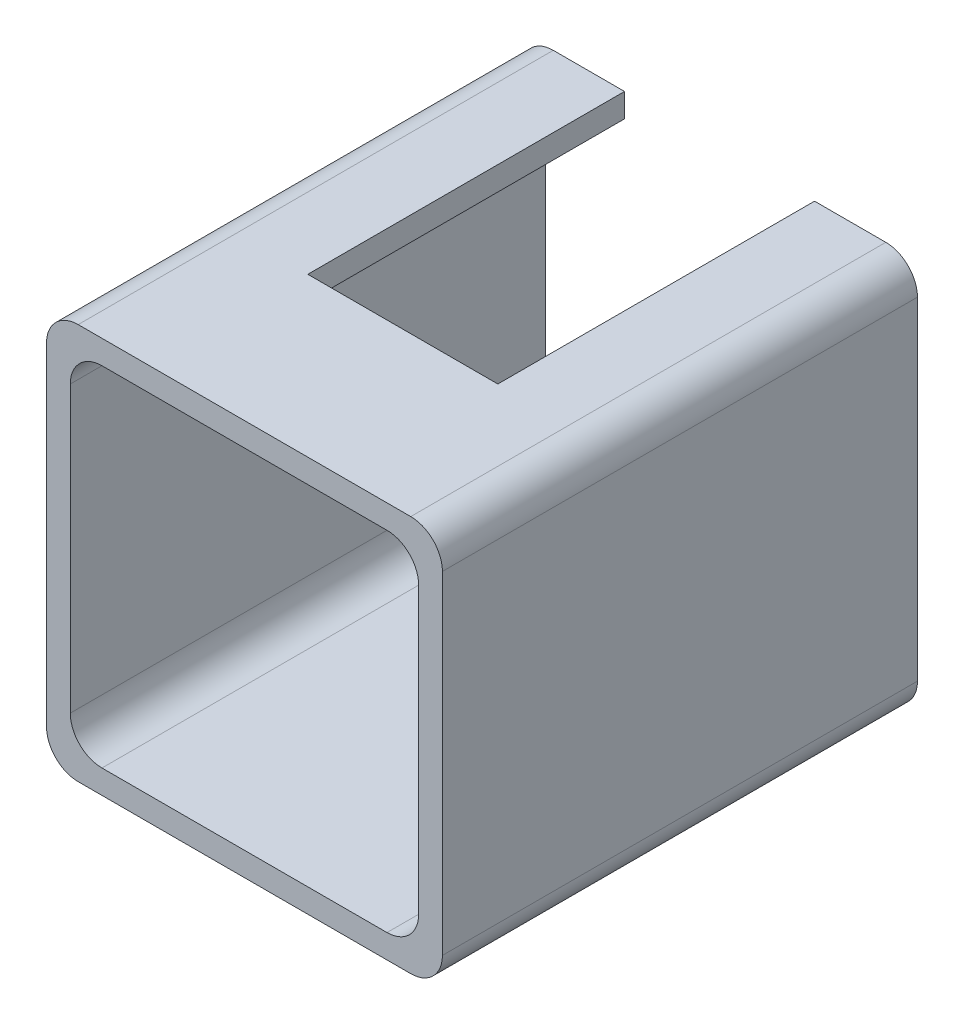
ISO-10303-21;
HEADER;
FILE_DESCRIPTION(('STEP AP214'),'2;1');
FILE_NAME('part.step','',(''),(''),'','','');
FILE_SCHEMA(('AUTOMOTIVE_DESIGN { 1 0 10303 214 1 1 1 1 }'));
ENDSEC;
DATA;
#1=APPLICATION_CONTEXT('core data for automotive mechanical design processes');
#2=APPLICATION_PROTOCOL_DEFINITION('international standard','automotive_design',2000,#1);
#3=PRODUCT_CONTEXT('',#1,'mechanical');
#4=PRODUCT('Part','Part','',(#3));
#5=PRODUCT_RELATED_PRODUCT_CATEGORY('part','',(#4));
#6=PRODUCT_DEFINITION_FORMATION('','',#4);
#7=PRODUCT_DEFINITION_CONTEXT('part definition',#1,'design');
#8=PRODUCT_DEFINITION('design','',#6,#7);
#9=PRODUCT_DEFINITION_SHAPE('','',#8);
#10=(LENGTH_UNIT() NAMED_UNIT(*) SI_UNIT(.MILLI.,.METRE.));
#11=(NAMED_UNIT(*) PLANE_ANGLE_UNIT() SI_UNIT($,.RADIAN.));
#12=(NAMED_UNIT(*) SI_UNIT($,.STERADIAN.) SOLID_ANGLE_UNIT());
#13=UNCERTAINTY_MEASURE_WITH_UNIT(LENGTH_MEASURE(1.E-05),#10,'distance_accuracy_value','');
#14=(GEOMETRIC_REPRESENTATION_CONTEXT(3) GLOBAL_UNCERTAINTY_ASSIGNED_CONTEXT((#13)) GLOBAL_UNIT_ASSIGNED_CONTEXT((#10,
#11,#12)) REPRESENTATION_CONTEXT('',''));
#15=CARTESIAN_POINT('',(0.,0.,0.));
#16=DIRECTION('',(0.,0.,1.));
#17=DIRECTION('',(1.,0.,0.));
#18=AXIS2_PLACEMENT_3D('',#15,#16,#17);
#19=CARTESIAN_POINT('',(-10.5,-10.5,30.));
#20=DIRECTION('',(0.,0.,-1.));
#21=DIRECTION('',(-1.,0.,0.));
#22=AXIS2_PLACEMENT_3D('',#19,#20,#21);
#23=PLANE('',#22);
#24=CARTESIAN_POINT('',(-10.5,-10.5,30.));
#25=DIRECTION('',(0.,0.,1.));
#26=DIRECTION('',(-1.,0.,0.));
#27=AXIS2_PLACEMENT_3D('',#24,#25,#26);
#28=CIRCLE('',#27,2.);
#29=CARTESIAN_POINT('',(-12.5,-10.5,30.));
#30=VERTEX_POINT('',#29);
#31=CARTESIAN_POINT('',(-10.5,-12.5,30.));
#32=VERTEX_POINT('',#31);
#33=EDGE_CURVE('E236',#30,#32,#28,.T.);
#34=ORIENTED_EDGE('',*,*,#33,.T.);
#35=DIRECTION('',(1.,0.,0.));
#36=VECTOR('',#35,1.);
#37=CARTESIAN_POINT('',(-10.5,-12.5,30.));
#38=LINE('',#37,#36);
#39=CARTESIAN_POINT('',(10.5,-12.5,30.));
#40=VERTEX_POINT('',#39);
#41=EDGE_CURVE('E239',#32,#40,#38,.T.);
#42=ORIENTED_EDGE('',*,*,#41,.T.);
#43=CARTESIAN_POINT('',(10.5,-10.5,30.));
#44=DIRECTION('',(0.,0.,1.));
#45=DIRECTION('',(-1.,0.,0.));
#46=AXIS2_PLACEMENT_3D('',#43,#44,#45);
#47=CIRCLE('',#46,2.);
#48=CARTESIAN_POINT('',(12.5,-10.5,30.));
#49=VERTEX_POINT('',#48);
#50=EDGE_CURVE('E242',#40,#49,#47,.T.);
#51=ORIENTED_EDGE('',*,*,#50,.T.);
#52=DIRECTION('',(0.,1.,0.));
#53=VECTOR('',#52,1.);
#54=CARTESIAN_POINT('',(12.5,10.5,30.));
#55=LINE('',#54,#53);
#56=CARTESIAN_POINT('',(12.5,10.5,30.));
#57=VERTEX_POINT('',#56);
#58=EDGE_CURVE('E244',#49,#57,#55,.T.);
#59=ORIENTED_EDGE('',*,*,#58,.T.);
#60=CARTESIAN_POINT('',(10.5,10.5,30.));
#61=DIRECTION('',(0.,0.,1.));
#62=DIRECTION('',(1.,0.,0.));
#63=AXIS2_PLACEMENT_3D('',#60,#61,#62);
#64=CIRCLE('',#63,2.);
#65=CARTESIAN_POINT('',(10.5,12.5,30.));
#66=VERTEX_POINT('',#65);
#67=EDGE_CURVE('E246',#57,#66,#64,.T.);
#68=ORIENTED_EDGE('',*,*,#67,.T.);
#69=DIRECTION('',(-1.,0.,0.));
#70=VECTOR('',#69,1.);
#71=CARTESIAN_POINT('',(-10.5,12.5,30.));
#72=LINE('',#71,#70);
#73=CARTESIAN_POINT('',(-10.5,12.5,30.));
#74=VERTEX_POINT('',#73);
#75=EDGE_CURVE('E248',#66,#74,#72,.T.);
#76=ORIENTED_EDGE('',*,*,#75,.T.);
#77=CARTESIAN_POINT('',(-10.5,10.5,30.));
#78=DIRECTION('',(0.,0.,1.));
#79=DIRECTION('',(-1.,0.,0.));
#80=AXIS2_PLACEMENT_3D('',#77,#78,#79);
#81=CIRCLE('',#80,2.);
#82=CARTESIAN_POINT('',(-12.5,10.5,30.));
#83=VERTEX_POINT('',#82);
#84=EDGE_CURVE('E250',#74,#83,#81,.T.);
#85=ORIENTED_EDGE('',*,*,#84,.T.);
#86=DIRECTION('',(0.,-1.,0.));
#87=VECTOR('',#86,1.);
#88=CARTESIAN_POINT('',(-12.5,10.5,30.));
#89=LINE('',#88,#87);
#90=EDGE_CURVE('E252',#83,#30,#89,.T.);
#91=ORIENTED_EDGE('',*,*,#90,.T.);
#92=EDGE_LOOP('',(#34,#42,#51,#59,#68,#76,#85,#91));
#93=FACE_BOUND('',#92,.T.);
#94=CARTESIAN_POINT('',(-9.,-9.,30.));
#95=DIRECTION('',(0.,0.,1.));
#96=DIRECTION('',(1.,0.,0.));
#97=AXIS2_PLACEMENT_3D('',#94,#95,#96);
#98=CIRCLE('',#97,2.);
#99=CARTESIAN_POINT('',(-11.,-8.99999999999999,30.));
#100=VERTEX_POINT('',#99);
#101=CARTESIAN_POINT('',(-8.99999999999998,-11.,30.));
#102=VERTEX_POINT('',#101);
#103=EDGE_CURVE('E215',#100,#102,#98,.T.);
#104=ORIENTED_EDGE('',*,*,#103,.F.);
#105=DIRECTION('',(0.,-1.,0.));
#106=VECTOR('',#105,1.);
#107=CARTESIAN_POINT('',(-11.,8.99999999999998,30.));
#108=LINE('',#107,#106);
#109=CARTESIAN_POINT('',(-11.,8.99999999999998,30.));
#110=VERTEX_POINT('',#109);
#111=EDGE_CURVE('E219',#110,#100,#108,.T.);
#112=ORIENTED_EDGE('',*,*,#111,.F.);
#113=CARTESIAN_POINT('',(-9.,9.,30.));
#114=DIRECTION('',(0.,0.,1.));
#115=DIRECTION('',(1.,0.,0.));
#116=AXIS2_PLACEMENT_3D('',#113,#114,#115);
#117=CIRCLE('',#116,2.);
#118=CARTESIAN_POINT('',(-8.99999999999999,11.,30.));
#119=VERTEX_POINT('',#118);
#120=EDGE_CURVE('E365',#119,#110,#117,.T.);
#121=ORIENTED_EDGE('',*,*,#120,.F.);
#122=DIRECTION('',(-1.,0.,0.));
#123=VECTOR('',#122,1.);
#124=CARTESIAN_POINT('',(-8.99999999999999,11.,30.));
#125=LINE('',#124,#123);
#126=CARTESIAN_POINT('',(8.99999999999999,11.,30.));
#127=VERTEX_POINT('',#126);
#128=EDGE_CURVE('E336',#127,#119,#125,.T.);
#129=ORIENTED_EDGE('',*,*,#128,.F.);
#130=CARTESIAN_POINT('',(9.,9.,30.));
#131=DIRECTION('',(0.,0.,1.));
#132=DIRECTION('',(-1.,0.,0.));
#133=AXIS2_PLACEMENT_3D('',#130,#131,#132);
#134=CIRCLE('',#133,2.);
#135=CARTESIAN_POINT('',(11.,8.99999999999998,30.));
#136=VERTEX_POINT('',#135);
#137=EDGE_CURVE('E362',#136,#127,#134,.T.);
#138=ORIENTED_EDGE('',*,*,#137,.F.);
#139=DIRECTION('',(0.,1.,0.));
#140=VECTOR('',#139,1.);
#141=CARTESIAN_POINT('',(11.,8.99999999999998,30.));
#142=LINE('',#141,#140);
#143=CARTESIAN_POINT('',(11.,-8.99999999999999,30.));
#144=VERTEX_POINT('',#143);
#145=EDGE_CURVE('E360',#144,#136,#142,.T.);
#146=ORIENTED_EDGE('',*,*,#145,.F.);
#147=CARTESIAN_POINT('',(9.,-9.,30.));
#148=DIRECTION('',(0.,0.,1.));
#149=DIRECTION('',(1.,0.,0.));
#150=AXIS2_PLACEMENT_3D('',#147,#148,#149);
#151=CIRCLE('',#150,2.);
#152=CARTESIAN_POINT('',(8.99999999999999,-11.,30.));
#153=VERTEX_POINT('',#152);
#154=EDGE_CURVE('E354',#153,#144,#151,.T.);
#155=ORIENTED_EDGE('',*,*,#154,.F.);
#156=DIRECTION('',(1.,0.,0.));
#157=VECTOR('',#156,1.);
#158=CARTESIAN_POINT('',(-8.99999999999998,-11.,30.));
#159=LINE('',#158,#157);
#160=EDGE_CURVE('E352',#102,#153,#159,.T.);
#161=ORIENTED_EDGE('',*,*,#160,.F.);
#162=EDGE_LOOP('',(#104,#112,#121,#129,#138,#146,#155,#161));
#163=FACE_BOUND('',#162,.T.);
#164=ADVANCED_FACE('F39',(#93,#163),#23,.F.);
#165=CARTESIAN_POINT('',(-10.5,-10.5,0.));
#166=DIRECTION('',(0.,0.,-1.));
#167=DIRECTION('',(-1.,0.,0.));
#168=AXIS2_PLACEMENT_3D('',#165,#166,#167);
#169=PLANE('',#168);
#170=DIRECTION('',(0.,1.,0.));
#171=VECTOR('',#170,1.);
#172=CARTESIAN_POINT('',(6.,-12.501,0.));
#173=LINE('',#172,#171);
#174=CARTESIAN_POINT('',(6.,11.,0.));
#175=VERTEX_POINT('',#174);
#176=CARTESIAN_POINT('',(6.,12.5,0.));
#177=VERTEX_POINT('',#176);
#178=EDGE_CURVE('E175',#175,#177,#173,.T.);
#179=ORIENTED_EDGE('',*,*,#178,.T.);
#180=DIRECTION('',(-1.,0.,0.));
#181=VECTOR('',#180,1.);
#182=CARTESIAN_POINT('',(-10.5,12.5,0.));
#183=LINE('',#182,#181);
#184=CARTESIAN_POINT('',(10.5,12.5,0.));
#185=VERTEX_POINT('',#184);
#186=EDGE_CURVE('E266',#185,#177,#183,.T.);
#187=ORIENTED_EDGE('',*,*,#186,.F.);
#188=CARTESIAN_POINT('',(10.5,10.5,0.));
#189=DIRECTION('',(0.,0.,1.));
#190=DIRECTION('',(1.,0.,0.));
#191=AXIS2_PLACEMENT_3D('',#188,#189,#190);
#192=CIRCLE('',#191,2.);
#193=CARTESIAN_POINT('',(12.5,10.5,0.));
#194=VERTEX_POINT('',#193);
#195=EDGE_CURVE('E263',#194,#185,#192,.T.);
#196=ORIENTED_EDGE('',*,*,#195,.F.);
#197=DIRECTION('',(0.,1.,0.));
#198=VECTOR('',#197,1.);
#199=CARTESIAN_POINT('',(12.5,10.5,0.));
#200=LINE('',#199,#198);
#201=CARTESIAN_POINT('',(12.5,-10.5,0.));
#202=VERTEX_POINT('',#201);
#203=EDGE_CURVE('E261',#202,#194,#200,.T.);
#204=ORIENTED_EDGE('',*,*,#203,.F.);
#205=CARTESIAN_POINT('',(10.5,-10.5,0.));
#206=DIRECTION('',(0.,0.,1.));
#207=DIRECTION('',(-1.,0.,0.));
#208=AXIS2_PLACEMENT_3D('',#205,#206,#207);
#209=CIRCLE('',#208,2.);
#210=CARTESIAN_POINT('',(10.5,-12.5,0.));
#211=VERTEX_POINT('',#210);
#212=EDGE_CURVE('E259',#211,#202,#209,.T.);
#213=ORIENTED_EDGE('',*,*,#212,.F.);
#214=DIRECTION('',(1.,0.,0.));
#215=VECTOR('',#214,1.);
#216=CARTESIAN_POINT('',(-10.5,-12.5,0.));
#217=LINE('',#216,#215);
#218=CARTESIAN_POINT('',(-10.5,-12.5,0.));
#219=VERTEX_POINT('',#218);
#220=EDGE_CURVE('E257',#219,#211,#217,.T.);
#221=ORIENTED_EDGE('',*,*,#220,.F.);
#222=CARTESIAN_POINT('',(-10.5,-10.5,0.));
#223=DIRECTION('',(0.,0.,1.));
#224=DIRECTION('',(-1.,0.,0.));
#225=AXIS2_PLACEMENT_3D('',#222,#223,#224);
#226=CIRCLE('',#225,2.);
#227=CARTESIAN_POINT('',(-12.5,-10.5,0.));
#228=VERTEX_POINT('',#227);
#229=EDGE_CURVE('E235',#228,#219,#226,.T.);
#230=ORIENTED_EDGE('',*,*,#229,.F.);
#231=DIRECTION('',(0.,-1.,0.));
#232=VECTOR('',#231,1.);
#233=CARTESIAN_POINT('',(-12.5,10.5,0.));
#234=LINE('',#233,#232);
#235=CARTESIAN_POINT('',(-12.5,10.5,0.));
#236=VERTEX_POINT('',#235);
#237=EDGE_CURVE('E240',#236,#228,#234,.T.);
#238=ORIENTED_EDGE('',*,*,#237,.F.);
#239=CARTESIAN_POINT('',(-10.5,10.5,0.));
#240=DIRECTION('',(0.,0.,1.));
#241=DIRECTION('',(-1.,0.,0.));
#242=AXIS2_PLACEMENT_3D('',#239,#240,#241);
#243=CIRCLE('',#242,2.);
#244=CARTESIAN_POINT('',(-10.5,12.5,0.));
#245=VERTEX_POINT('',#244);
#246=EDGE_CURVE('E268',#245,#236,#243,.T.);
#247=ORIENTED_EDGE('',*,*,#246,.F.);
#248=CARTESIAN_POINT('',(-6.,12.5,0.));
#249=VERTEX_POINT('',#248);
#250=EDGE_CURVE('E265',#249,#245,#183,.T.);
#251=ORIENTED_EDGE('',*,*,#250,.F.);
#252=DIRECTION('',(0.,1.,0.));
#253=VECTOR('',#252,1.);
#254=CARTESIAN_POINT('',(-6.,-12.501,0.));
#255=LINE('',#254,#253);
#256=CARTESIAN_POINT('',(-6.,11.,0.));
#257=VERTEX_POINT('',#256);
#258=EDGE_CURVE('E186',#257,#249,#255,.T.);
#259=ORIENTED_EDGE('',*,*,#258,.F.);
#260=DIRECTION('',(-1.,0.,0.));
#261=VECTOR('',#260,1.);
#262=CARTESIAN_POINT('',(-8.99999999999999,11.,0.));
#263=LINE('',#262,#261);
#264=CARTESIAN_POINT('',(-8.99999999999999,11.,0.));
#265=VERTEX_POINT('',#264);
#266=EDGE_CURVE('E205',#257,#265,#263,.T.);
#267=ORIENTED_EDGE('',*,*,#266,.T.);
#268=CARTESIAN_POINT('',(-9.,9.,0.));
#269=DIRECTION('',(0.,0.,1.));
#270=DIRECTION('',(1.,0.,0.));
#271=AXIS2_PLACEMENT_3D('',#268,#269,#270);
#272=CIRCLE('',#271,2.);
#273=CARTESIAN_POINT('',(-11.,8.99999999999998,0.));
#274=VERTEX_POINT('',#273);
#275=EDGE_CURVE('E204',#265,#274,#272,.T.);
#276=ORIENTED_EDGE('',*,*,#275,.T.);
#277=DIRECTION('',(0.,-1.,0.));
#278=VECTOR('',#277,1.);
#279=CARTESIAN_POINT('',(-11.,8.99999999999998,0.));
#280=LINE('',#279,#278);
#281=CARTESIAN_POINT('',(-11.,-8.99999999999999,0.));
#282=VERTEX_POINT('',#281);
#283=EDGE_CURVE('E208',#274,#282,#280,.T.);
#284=ORIENTED_EDGE('',*,*,#283,.T.);
#285=CARTESIAN_POINT('',(-9.,-9.,0.));
#286=DIRECTION('',(0.,0.,1.));
#287=DIRECTION('',(1.,0.,0.));
#288=AXIS2_PLACEMENT_3D('',#285,#286,#287);
#289=CIRCLE('',#288,2.);
#290=CARTESIAN_POINT('',(-8.99999999999998,-11.,0.));
#291=VERTEX_POINT('',#290);
#292=EDGE_CURVE('E342',#282,#291,#289,.T.);
#293=ORIENTED_EDGE('',*,*,#292,.T.);
#294=DIRECTION('',(1.,0.,0.));
#295=VECTOR('',#294,1.);
#296=CARTESIAN_POINT('',(-8.99999999999998,-11.,0.));
#297=LINE('',#296,#295);
#298=CARTESIAN_POINT('',(8.99999999999999,-11.,0.));
#299=VERTEX_POINT('',#298);
#300=EDGE_CURVE('E369',#291,#299,#297,.T.);
#301=ORIENTED_EDGE('',*,*,#300,.T.);
#302=CARTESIAN_POINT('',(9.,-9.,0.));
#303=DIRECTION('',(0.,0.,1.));
#304=DIRECTION('',(1.,0.,0.));
#305=AXIS2_PLACEMENT_3D('',#302,#303,#304);
#306=CIRCLE('',#305,2.);
#307=CARTESIAN_POINT('',(11.,-8.99999999999999,0.));
#308=VERTEX_POINT('',#307);
#309=EDGE_CURVE('E371',#299,#308,#306,.T.);
#310=ORIENTED_EDGE('',*,*,#309,.T.);
#311=DIRECTION('',(0.,1.,0.));
#312=VECTOR('',#311,1.);
#313=CARTESIAN_POINT('',(11.,8.99999999999998,0.));
#314=LINE('',#313,#312);
#315=CARTESIAN_POINT('',(11.,8.99999999999998,0.));
#316=VERTEX_POINT('',#315);
#317=EDGE_CURVE('E373',#308,#316,#314,.T.);
#318=ORIENTED_EDGE('',*,*,#317,.T.);
#319=CARTESIAN_POINT('',(9.,9.,0.));
#320=DIRECTION('',(0.,0.,1.));
#321=DIRECTION('',(-1.,0.,0.));
#322=AXIS2_PLACEMENT_3D('',#319,#320,#321);
#323=CIRCLE('',#322,2.);
#324=CARTESIAN_POINT('',(8.99999999999999,11.,0.));
#325=VERTEX_POINT('',#324);
#326=EDGE_CURVE('E203',#316,#325,#323,.T.);
#327=ORIENTED_EDGE('',*,*,#326,.T.);
#328=EDGE_CURVE('E194',#325,#175,#263,.T.);
#329=ORIENTED_EDGE('',*,*,#328,.T.);
#330=EDGE_LOOP('',(#179,#187,#196,#204,#213,#221,#230,#238,#247,#251,#259,#267,#276,#284,#293,
#301,#310,#318,#327,#329));
#331=FACE_BOUND('',#330,.T.);
#332=ADVANCED_FACE('F200',(#331),#169,.T.);
#333=CARTESIAN_POINT('',(-10.5,-10.5,30.));
#334=DIRECTION('',(0.,0.,-1.));
#335=DIRECTION('',(-1.,0.,0.));
#336=AXIS2_PLACEMENT_3D('',#333,#334,#335);
#337=CYLINDRICAL_SURFACE('',#336,2.);
#338=ORIENTED_EDGE('',*,*,#229,.T.);
#339=DIRECTION('',(0.,0.,-1.));
#340=VECTOR('',#339,1.);
#341=CARTESIAN_POINT('',(-10.5,-12.5,30.));
#342=LINE('',#341,#340);
#343=EDGE_CURVE('E11',#32,#219,#342,.T.);
#344=ORIENTED_EDGE('',*,*,#343,.F.);
#345=ORIENTED_EDGE('',*,*,#33,.F.);
#346=DIRECTION('',(0.,0.,-1.));
#347=VECTOR('',#346,1.);
#348=CARTESIAN_POINT('',(-12.5,-10.5,30.));
#349=LINE('',#348,#347);
#350=EDGE_CURVE('E254',#30,#228,#349,.T.);
#351=ORIENTED_EDGE('',*,*,#350,.T.);
#352=EDGE_LOOP('',(#338,#344,#345,#351));
#353=FACE_BOUND('',#352,.T.);
#354=ADVANCED_FACE('F41',(#353),#337,.T.);
#355=CARTESIAN_POINT('',(-10.5,-12.5,30.));
#356=DIRECTION('',(0.,1.,0.));
#357=DIRECTION('',(-1.,0.,0.));
#358=AXIS2_PLACEMENT_3D('',#355,#356,#357);
#359=PLANE('',#358);
#360=ORIENTED_EDGE('',*,*,#220,.T.);
#361=DIRECTION('',(0.,0.,-1.));
#362=VECTOR('',#361,1.);
#363=CARTESIAN_POINT('',(10.5,-12.5,30.));
#364=LINE('',#363,#362);
#365=EDGE_CURVE('E47',#40,#211,#364,.T.);
#366=ORIENTED_EDGE('',*,*,#365,.F.);
#367=ORIENTED_EDGE('',*,*,#41,.F.);
#368=ORIENTED_EDGE('',*,*,#343,.T.);
#369=EDGE_LOOP('',(#360,#366,#367,#368));
#370=FACE_BOUND('',#369,.T.);
#371=ADVANCED_FACE('F312',(#370),#359,.F.);
#372=CARTESIAN_POINT('',(10.5,-10.5,30.));
#373=DIRECTION('',(0.,0.,-1.));
#374=DIRECTION('',(-1.,0.,0.));
#375=AXIS2_PLACEMENT_3D('',#372,#373,#374);
#376=CYLINDRICAL_SURFACE('',#375,2.);
#377=ORIENTED_EDGE('',*,*,#212,.T.);
#378=DIRECTION('',(0.,0.,-1.));
#379=VECTOR('',#378,1.);
#380=CARTESIAN_POINT('',(12.5,-10.5,30.));
#381=LINE('',#380,#379);
#382=EDGE_CURVE('E285',#49,#202,#381,.T.);
#383=ORIENTED_EDGE('',*,*,#382,.F.);
#384=ORIENTED_EDGE('',*,*,#50,.F.);
#385=ORIENTED_EDGE('',*,*,#365,.T.);
#386=EDGE_LOOP('',(#377,#383,#384,#385));
#387=FACE_BOUND('',#386,.T.);
#388=ADVANCED_FACE('F292',(#387),#376,.T.);
#389=CARTESIAN_POINT('',(12.5,10.5,30.));
#390=DIRECTION('',(-1.,0.,0.));
#391=DIRECTION('',(0.,-1.,0.));
#392=AXIS2_PLACEMENT_3D('',#389,#390,#391);
#393=PLANE('',#392);
#394=ORIENTED_EDGE('',*,*,#203,.T.);
#395=DIRECTION('',(0.,0.,-1.));
#396=VECTOR('',#395,1.);
#397=CARTESIAN_POINT('',(12.5,10.5,30.));
#398=LINE('',#397,#396);
#399=EDGE_CURVE('E282',#57,#194,#398,.T.);
#400=ORIENTED_EDGE('',*,*,#399,.F.);
#401=ORIENTED_EDGE('',*,*,#58,.F.);
#402=ORIENTED_EDGE('',*,*,#382,.T.);
#403=EDGE_LOOP('',(#394,#400,#401,#402));
#404=FACE_BOUND('',#403,.T.);
#405=ADVANCED_FACE('F300',(#404),#393,.F.);
#406=CARTESIAN_POINT('',(10.5,10.5,30.));
#407=DIRECTION('',(0.,0.,-1.));
#408=DIRECTION('',(-1.,0.,0.));
#409=AXIS2_PLACEMENT_3D('',#406,#407,#408);
#410=CYLINDRICAL_SURFACE('',#409,2.);
#411=ORIENTED_EDGE('',*,*,#195,.T.);
#412=DIRECTION('',(0.,0.,-1.));
#413=VECTOR('',#412,1.);
#414=CARTESIAN_POINT('',(10.5,12.5,30.));
#415=LINE('',#414,#413);
#416=EDGE_CURVE('E279',#66,#185,#415,.T.);
#417=ORIENTED_EDGE('',*,*,#416,.F.);
#418=ORIENTED_EDGE('',*,*,#67,.F.);
#419=ORIENTED_EDGE('',*,*,#399,.T.);
#420=EDGE_LOOP('',(#411,#417,#418,#419));
#421=FACE_BOUND('',#420,.T.);
#422=ADVANCED_FACE('F304',(#421),#410,.T.);
#423=CARTESIAN_POINT('',(-10.5,12.5,30.));
#424=DIRECTION('',(0.,-1.,0.));
#425=DIRECTION('',(0.,0.,-1.));
#426=AXIS2_PLACEMENT_3D('',#423,#424,#425);
#427=PLANE('',#426);
#428=ORIENTED_EDGE('',*,*,#186,.T.);
#429=DIRECTION('',(0.,0.,-1.));
#430=VECTOR('',#429,1.);
#431=CARTESIAN_POINT('',(6.,12.5,0.));
#432=LINE('',#431,#430);
#433=CARTESIAN_POINT('',(6.,12.5,20.));
#434=VERTEX_POINT('',#433);
#435=EDGE_CURVE('E181',#434,#177,#432,.T.);
#436=ORIENTED_EDGE('',*,*,#435,.F.);
#437=DIRECTION('',(1.,0.,0.));
#438=VECTOR('',#437,1.);
#439=CARTESIAN_POINT('',(-6.,12.5,20.));
#440=LINE('',#439,#438);
#441=CARTESIAN_POINT('',(-6.,12.5,20.));
#442=VERTEX_POINT('',#441);
#443=EDGE_CURVE('E553',#442,#434,#440,.T.);
#444=ORIENTED_EDGE('',*,*,#443,.F.);
#445=DIRECTION('',(0.,0.,1.));
#446=VECTOR('',#445,1.);
#447=CARTESIAN_POINT('',(-6.,12.5,0.));
#448=LINE('',#447,#446);
#449=EDGE_CURVE('E329',#249,#442,#448,.T.);
#450=ORIENTED_EDGE('',*,*,#449,.F.);
#451=ORIENTED_EDGE('',*,*,#250,.T.);
#452=DIRECTION('',(0.,0.,-1.));
#453=VECTOR('',#452,1.);
#454=CARTESIAN_POINT('',(-10.5,12.5,30.));
#455=LINE('',#454,#453);
#456=EDGE_CURVE('E276',#74,#245,#455,.T.);
#457=ORIENTED_EDGE('',*,*,#456,.F.);
#458=ORIENTED_EDGE('',*,*,#75,.F.);
#459=ORIENTED_EDGE('',*,*,#416,.T.);
#460=EDGE_LOOP('',(#428,#436,#444,#450,#451,#457,#458,#459));
#461=FACE_BOUND('',#460,.T.);
#462=ADVANCED_FACE('F326',(#461),#427,.F.);
#463=CARTESIAN_POINT('',(-10.5,10.5,30.));
#464=DIRECTION('',(0.,0.,-1.));
#465=DIRECTION('',(-1.,0.,0.));
#466=AXIS2_PLACEMENT_3D('',#463,#464,#465);
#467=CYLINDRICAL_SURFACE('',#466,2.);
#468=ORIENTED_EDGE('',*,*,#246,.T.);
#469=DIRECTION('',(0.,0.,-1.));
#470=VECTOR('',#469,1.);
#471=CARTESIAN_POINT('',(-12.5,10.5,30.));
#472=LINE('',#471,#470);
#473=EDGE_CURVE('E273',#83,#236,#472,.T.);
#474=ORIENTED_EDGE('',*,*,#473,.F.);
#475=ORIENTED_EDGE('',*,*,#84,.F.);
#476=ORIENTED_EDGE('',*,*,#456,.T.);
#477=EDGE_LOOP('',(#468,#474,#475,#476));
#478=FACE_BOUND('',#477,.T.);
#479=ADVANCED_FACE('F324',(#478),#467,.T.);
#480=CARTESIAN_POINT('',(-12.5,10.5,30.));
#481=DIRECTION('',(1.,0.,0.));
#482=DIRECTION('',(0.,1.,0.));
#483=AXIS2_PLACEMENT_3D('',#480,#481,#482);
#484=PLANE('',#483);
#485=ORIENTED_EDGE('',*,*,#237,.T.);
#486=ORIENTED_EDGE('',*,*,#350,.F.);
#487=ORIENTED_EDGE('',*,*,#90,.F.);
#488=ORIENTED_EDGE('',*,*,#473,.T.);
#489=EDGE_LOOP('',(#485,#486,#487,#488));
#490=FACE_BOUND('',#489,.T.);
#491=ADVANCED_FACE('F319',(#490),#484,.F.);
#492=CARTESIAN_POINT('',(-9.,-9.,30.));
#493=DIRECTION('',(0.,0.,-1.));
#494=DIRECTION('',(-1.,0.,0.));
#495=AXIS2_PLACEMENT_3D('',#492,#493,#494);
#496=CYLINDRICAL_SURFACE('',#495,2.);
#497=ORIENTED_EDGE('',*,*,#292,.F.);
#498=DIRECTION('',(0.,0.,-1.));
#499=VECTOR('',#498,1.);
#500=CARTESIAN_POINT('',(-11.,-8.99999999999999,30.));
#501=LINE('',#500,#499);
#502=EDGE_CURVE('E216',#100,#282,#501,.T.);
#503=ORIENTED_EDGE('',*,*,#502,.F.);
#504=ORIENTED_EDGE('',*,*,#103,.T.);
#505=DIRECTION('',(0.,0.,-1.));
#506=VECTOR('',#505,1.);
#507=CARTESIAN_POINT('',(-8.99999999999998,-11.,30.));
#508=LINE('',#507,#506);
#509=EDGE_CURVE('E232',#102,#291,#508,.T.);
#510=ORIENTED_EDGE('',*,*,#509,.T.);
#511=EDGE_LOOP('',(#497,#503,#504,#510));
#512=FACE_BOUND('',#511,.T.);
#513=ADVANCED_FACE('F348',(#512),#496,.F.);
#514=CARTESIAN_POINT('',(-8.99999999999998,-11.,30.));
#515=DIRECTION('',(0.,1.,0.));
#516=DIRECTION('',(0.,0.,1.));
#517=AXIS2_PLACEMENT_3D('',#514,#515,#516);
#518=PLANE('',#517);
#519=ORIENTED_EDGE('',*,*,#300,.F.);
#520=ORIENTED_EDGE('',*,*,#509,.F.);
#521=ORIENTED_EDGE('',*,*,#160,.T.);
#522=DIRECTION('',(0.,0.,-1.));
#523=VECTOR('',#522,1.);
#524=CARTESIAN_POINT('',(8.99999999999999,-11.,30.));
#525=LINE('',#524,#523);
#526=EDGE_CURVE('E230',#153,#299,#525,.T.);
#527=ORIENTED_EDGE('',*,*,#526,.T.);
#528=EDGE_LOOP('',(#519,#520,#521,#527));
#529=FACE_BOUND('',#528,.T.);
#530=ADVANCED_FACE('F388',(#529),#518,.T.);
#531=CARTESIAN_POINT('',(9.,-9.,30.));
#532=DIRECTION('',(0.,0.,-1.));
#533=DIRECTION('',(-1.,0.,0.));
#534=AXIS2_PLACEMENT_3D('',#531,#532,#533);
#535=CYLINDRICAL_SURFACE('',#534,2.);
#536=ORIENTED_EDGE('',*,*,#309,.F.);
#537=ORIENTED_EDGE('',*,*,#526,.F.);
#538=ORIENTED_EDGE('',*,*,#154,.T.);
#539=DIRECTION('',(0.,0.,-1.));
#540=VECTOR('',#539,1.);
#541=CARTESIAN_POINT('',(11.,-8.99999999999999,30.));
#542=LINE('',#541,#540);
#543=EDGE_CURVE('E228',#144,#308,#542,.T.);
#544=ORIENTED_EDGE('',*,*,#543,.T.);
#545=EDGE_LOOP('',(#536,#537,#538,#544));
#546=FACE_BOUND('',#545,.T.);
#547=ADVANCED_FACE('F386',(#546),#535,.F.);
#548=CARTESIAN_POINT('',(11.,8.99999999999998,30.));
#549=DIRECTION('',(-1.,0.,0.));
#550=DIRECTION('',(0.,-1.,0.));
#551=AXIS2_PLACEMENT_3D('',#548,#549,#550);
#552=PLANE('',#551);
#553=ORIENTED_EDGE('',*,*,#317,.F.);
#554=ORIENTED_EDGE('',*,*,#543,.F.);
#555=ORIENTED_EDGE('',*,*,#145,.T.);
#556=DIRECTION('',(0.,0.,-1.));
#557=VECTOR('',#556,1.);
#558=CARTESIAN_POINT('',(11.,8.99999999999998,30.));
#559=LINE('',#558,#557);
#560=EDGE_CURVE('E226',#136,#316,#559,.T.);
#561=ORIENTED_EDGE('',*,*,#560,.T.);
#562=EDGE_LOOP('',(#553,#554,#555,#561));
#563=FACE_BOUND('',#562,.T.);
#564=ADVANCED_FACE('F378',(#563),#552,.T.);
#565=CARTESIAN_POINT('',(9.,9.,30.));
#566=DIRECTION('',(0.,0.,-1.));
#567=DIRECTION('',(-1.,0.,0.));
#568=AXIS2_PLACEMENT_3D('',#565,#566,#567);
#569=CYLINDRICAL_SURFACE('',#568,2.);
#570=ORIENTED_EDGE('',*,*,#326,.F.);
#571=ORIENTED_EDGE('',*,*,#560,.F.);
#572=ORIENTED_EDGE('',*,*,#137,.T.);
#573=DIRECTION('',(0.,0.,-1.));
#574=VECTOR('',#573,1.);
#575=CARTESIAN_POINT('',(8.99999999999999,11.,30.));
#576=LINE('',#575,#574);
#577=EDGE_CURVE('E224',#127,#325,#576,.T.);
#578=ORIENTED_EDGE('',*,*,#577,.T.);
#579=EDGE_LOOP('',(#570,#571,#572,#578));
#580=FACE_BOUND('',#579,.T.);
#581=ADVANCED_FACE('F383',(#580),#569,.F.);
#582=CARTESIAN_POINT('',(-8.99999999999999,11.,30.));
#583=DIRECTION('',(0.,-1.,0.));
#584=DIRECTION('',(0.,0.,-1.));
#585=AXIS2_PLACEMENT_3D('',#582,#583,#584);
#586=PLANE('',#585);
#587=DIRECTION('',(0.,0.,-1.));
#588=VECTOR('',#587,1.);
#589=CARTESIAN_POINT('',(6.,11.,0.));
#590=LINE('',#589,#588);
#591=CARTESIAN_POINT('',(6.,11.,20.));
#592=VERTEX_POINT('',#591);
#593=EDGE_CURVE('E178',#592,#175,#590,.T.);
#594=ORIENTED_EDGE('',*,*,#593,.T.);
#595=ORIENTED_EDGE('',*,*,#328,.F.);
#596=ORIENTED_EDGE('',*,*,#577,.F.);
#597=ORIENTED_EDGE('',*,*,#128,.T.);
#598=DIRECTION('',(0.,0.,-1.));
#599=VECTOR('',#598,1.);
#600=CARTESIAN_POINT('',(-8.99999999999999,11.,30.));
#601=LINE('',#600,#599);
#602=EDGE_CURVE('E221',#119,#265,#601,.T.);
#603=ORIENTED_EDGE('',*,*,#602,.T.);
#604=ORIENTED_EDGE('',*,*,#266,.F.);
#605=DIRECTION('',(0.,0.,1.));
#606=VECTOR('',#605,1.);
#607=CARTESIAN_POINT('',(-6.,11.,0.));
#608=LINE('',#607,#606);
#609=CARTESIAN_POINT('',(-6.,11.,20.));
#610=VERTEX_POINT('',#609);
#611=EDGE_CURVE('E198',#257,#610,#608,.T.);
#612=ORIENTED_EDGE('',*,*,#611,.T.);
#613=DIRECTION('',(1.,0.,0.));
#614=VECTOR('',#613,1.);
#615=CARTESIAN_POINT('',(-6.,11.,20.));
#616=LINE('',#615,#614);
#617=EDGE_CURVE('E197',#610,#592,#616,.T.);
#618=ORIENTED_EDGE('',*,*,#617,.T.);
#619=EDGE_LOOP('',(#594,#595,#596,#597,#603,#604,#612,#618));
#620=FACE_BOUND('',#619,.T.);
#621=ADVANCED_FACE('F192',(#620),#586,.T.);
#622=CARTESIAN_POINT('',(-9.,9.,30.));
#623=DIRECTION('',(0.,0.,-1.));
#624=DIRECTION('',(-1.,0.,0.));
#625=AXIS2_PLACEMENT_3D('',#622,#623,#624);
#626=CYLINDRICAL_SURFACE('',#625,2.);
#627=ORIENTED_EDGE('',*,*,#275,.F.);
#628=ORIENTED_EDGE('',*,*,#602,.F.);
#629=ORIENTED_EDGE('',*,*,#120,.T.);
#630=DIRECTION('',(0.,0.,-1.));
#631=VECTOR('',#630,1.);
#632=CARTESIAN_POINT('',(-11.,8.99999999999998,30.));
#633=LINE('',#632,#631);
#634=EDGE_CURVE('E62',#110,#274,#633,.T.);
#635=ORIENTED_EDGE('',*,*,#634,.T.);
#636=EDGE_LOOP('',(#627,#628,#629,#635));
#637=FACE_BOUND('',#636,.T.);
#638=ADVANCED_FACE('F339',(#637),#626,.F.);
#639=CARTESIAN_POINT('',(-11.,8.99999999999998,30.));
#640=DIRECTION('',(1.,0.,0.));
#641=DIRECTION('',(0.,1.,0.));
#642=AXIS2_PLACEMENT_3D('',#639,#640,#641);
#643=PLANE('',#642);
#644=ORIENTED_EDGE('',*,*,#283,.F.);
#645=ORIENTED_EDGE('',*,*,#634,.F.);
#646=ORIENTED_EDGE('',*,*,#111,.T.);
#647=ORIENTED_EDGE('',*,*,#502,.T.);
#648=EDGE_LOOP('',(#644,#645,#646,#647));
#649=FACE_BOUND('',#648,.T.);
#650=ADVANCED_FACE('F343',(#649),#643,.T.);
#651=CARTESIAN_POINT('',(-6.,-12.501,20.));
#652=DIRECTION('',(0.,0.,1.));
#653=DIRECTION('',(1.,0.,0.));
#654=AXIS2_PLACEMENT_3D('',#651,#652,#653);
#655=PLANE('',#654);
#656=DIRECTION('',(0.,1.,0.));
#657=VECTOR('',#656,1.);
#658=CARTESIAN_POINT('',(-6.,-12.501,20.));
#659=LINE('',#658,#657);
#660=EDGE_CURVE('E54',#610,#442,#659,.T.);
#661=ORIENTED_EDGE('',*,*,#660,.T.);
#662=ORIENTED_EDGE('',*,*,#443,.T.);
#663=DIRECTION('',(0.,1.,0.));
#664=VECTOR('',#663,1.);
#665=CARTESIAN_POINT('',(6.,-12.501,20.));
#666=LINE('',#665,#664);
#667=EDGE_CURVE('E187',#592,#434,#666,.T.);
#668=ORIENTED_EDGE('',*,*,#667,.F.);
#669=ORIENTED_EDGE('',*,*,#617,.F.);
#670=EDGE_LOOP('',(#661,#662,#668,#669));
#671=FACE_BOUND('',#670,.T.);
#672=ADVANCED_FACE('F524',(#671),#655,.F.);
#673=CARTESIAN_POINT('',(6.,-12.501,0.));
#674=DIRECTION('',(1.,0.,0.));
#675=DIRECTION('',(0.,0.,-1.));
#676=AXIS2_PLACEMENT_3D('',#673,#674,#675);
#677=PLANE('',#676);
#678=ORIENTED_EDGE('',*,*,#667,.T.);
#679=ORIENTED_EDGE('',*,*,#435,.T.);
#680=ORIENTED_EDGE('',*,*,#178,.F.);
#681=ORIENTED_EDGE('',*,*,#593,.F.);
#682=EDGE_LOOP('',(#678,#679,#680,#681));
#683=FACE_BOUND('',#682,.T.);
#684=ADVANCED_FACE('F177',(#683),#677,.F.);
#685=CARTESIAN_POINT('',(-6.,-12.501,0.));
#686=DIRECTION('',(-1.,0.,0.));
#687=DIRECTION('',(0.,0.,1.));
#688=AXIS2_PLACEMENT_3D('',#685,#686,#687);
#689=PLANE('',#688);
#690=ORIENTED_EDGE('',*,*,#258,.T.);
#691=ORIENTED_EDGE('',*,*,#449,.T.);
#692=ORIENTED_EDGE('',*,*,#660,.F.);
#693=ORIENTED_EDGE('',*,*,#611,.F.);
#694=EDGE_LOOP('',(#690,#691,#692,#693));
#695=FACE_BOUND('',#694,.T.);
#696=ADVANCED_FACE('F541',(#695),#689,.F.);
#697=CLOSED_SHELL('',(#164,#332,#354,#371,#388,#405,#422,#462,#479,#491,#513,#530,#547,#564,
#581,#621,#638,#650,#672,#684,#696));
#698=MANIFOLD_SOLID_BREP('B2',#697);
#699=ADVANCED_BREP_SHAPE_REPRESENTATION('',(#18,#698),#14);
#700=SHAPE_DEFINITION_REPRESENTATION(#9,#699);
ENDSEC;
END-ISO-10303-21;
